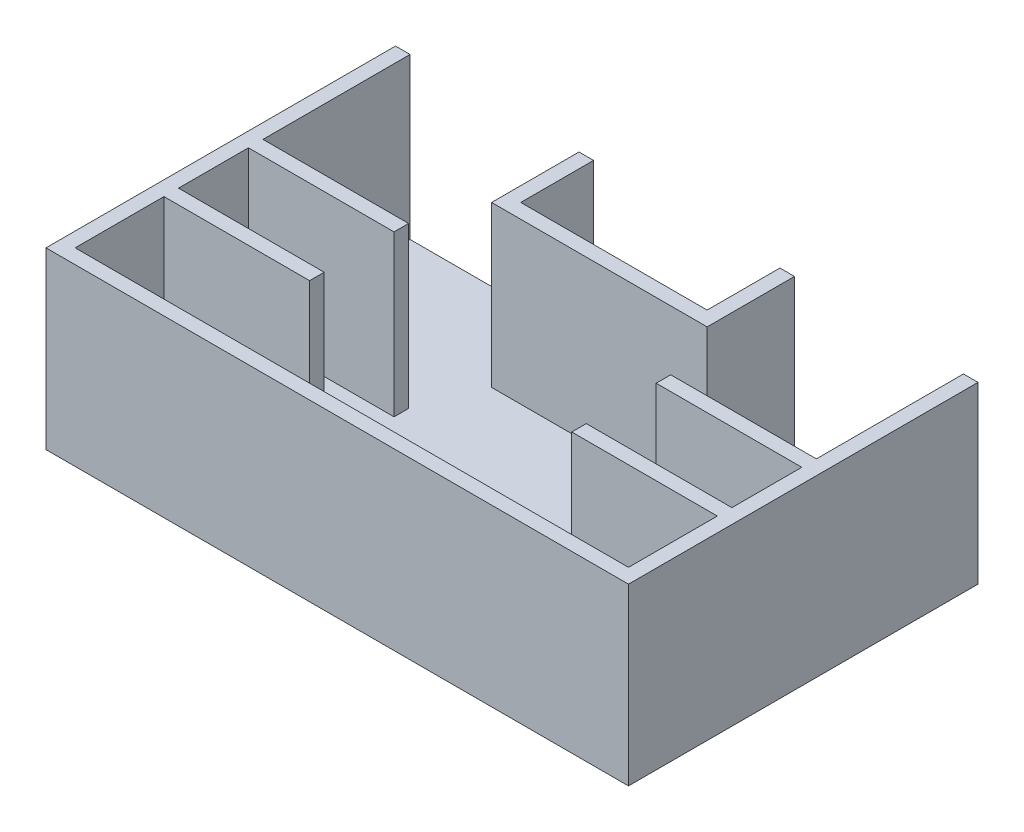
ISO-10303-21;
HEADER;
FILE_DESCRIPTION(('STEP AP214'),'2;1');
FILE_NAME('part.step','',(''),(''),'','','');
FILE_SCHEMA(('AUTOMOTIVE_DESIGN { 1 0 10303 214 1 1 1 1 }'));
ENDSEC;
DATA;
#1=APPLICATION_CONTEXT('core data for automotive mechanical design processes');
#2=APPLICATION_PROTOCOL_DEFINITION('international standard','automotive_design',2000,#1);
#3=PRODUCT_CONTEXT('',#1,'mechanical');
#4=PRODUCT('Part','Part','',(#3));
#5=PRODUCT_RELATED_PRODUCT_CATEGORY('part','',(#4));
#6=PRODUCT_DEFINITION_FORMATION('','',#4);
#7=PRODUCT_DEFINITION_CONTEXT('part definition',#1,'design');
#8=PRODUCT_DEFINITION('design','',#6,#7);
#9=PRODUCT_DEFINITION_SHAPE('','',#8);
#10=(LENGTH_UNIT() NAMED_UNIT(*) SI_UNIT(.MILLI.,.METRE.));
#11=(NAMED_UNIT(*) PLANE_ANGLE_UNIT() SI_UNIT($,.RADIAN.));
#12=(NAMED_UNIT(*) SI_UNIT($,.STERADIAN.) SOLID_ANGLE_UNIT());
#13=UNCERTAINTY_MEASURE_WITH_UNIT(LENGTH_MEASURE(1.E-05),#10,'distance_accuracy_value','');
#14=(GEOMETRIC_REPRESENTATION_CONTEXT(3) GLOBAL_UNCERTAINTY_ASSIGNED_CONTEXT((#13)) GLOBAL_UNIT_ASSIGNED_CONTEXT((#10,
#11,#12)) REPRESENTATION_CONTEXT('',''));
#15=CARTESIAN_POINT('',(0.,0.,0.));
#16=DIRECTION('',(0.,0.,1.));
#17=DIRECTION('',(1.,0.,0.));
#18=AXIS2_PLACEMENT_3D('',#15,#16,#17);
#19=CARTESIAN_POINT('',(0.,30.,0.));
#20=DIRECTION('',(0.,1.,0.));
#21=DIRECTION('',(0.,0.,1.));
#22=AXIS2_PLACEMENT_3D('',#19,#20,#21);
#23=PLANE('',#22);
#24=DIRECTION('',(1.,0.,0.));
#25=VECTOR('',#24,1.);
#26=CARTESIAN_POINT('',(-100.,30.,-10.));
#27=LINE('',#26,#25);
#28=CARTESIAN_POINT('',(-50.,30.,-10.));
#29=VERTEX_POINT('',#28);
#30=CARTESIAN_POINT('',(-47.5,30.,-10.));
#31=VERTEX_POINT('',#30);
#32=EDGE_CURVE('E260',#29,#31,#27,.T.);
#33=ORIENTED_EDGE('',*,*,#32,.F.);
#34=DIRECTION('',(0.,0.,1.));
#35=VECTOR('',#34,1.);
#36=CARTESIAN_POINT('',(-50.,30.,-50.));
#37=LINE('',#36,#35);
#38=CARTESIAN_POINT('',(-50.,30.,50.));
#39=VERTEX_POINT('',#38);
#40=EDGE_CURVE('E278',#29,#39,#37,.T.);
#41=ORIENTED_EDGE('',*,*,#40,.T.);
#42=DIRECTION('',(1.,0.,0.));
#43=VECTOR('',#42,1.);
#44=CARTESIAN_POINT('',(-50.,30.,50.));
#45=LINE('',#44,#43);
#46=CARTESIAN_POINT('',(50.,30.,50.));
#47=VERTEX_POINT('',#46);
#48=EDGE_CURVE('E273',#39,#47,#45,.T.);
#49=ORIENTED_EDGE('',*,*,#48,.T.);
#50=DIRECTION('',(0.,0.,-1.));
#51=VECTOR('',#50,1.);
#52=CARTESIAN_POINT('',(50.,30.,50.));
#53=LINE('',#52,#51);
#54=CARTESIAN_POINT('',(50.,30.,-10.));
#55=VERTEX_POINT('',#54);
#56=EDGE_CURVE('E266',#47,#55,#53,.T.);
#57=ORIENTED_EDGE('',*,*,#56,.T.);
#58=CARTESIAN_POINT('',(47.5,30.,-10.));
#59=VERTEX_POINT('',#58);
#60=EDGE_CURVE('E247',#59,#55,#27,.T.);
#61=ORIENTED_EDGE('',*,*,#60,.F.);
#62=DIRECTION('',(0.,0.,-1.));
#63=VECTOR('',#62,1.);
#64=CARTESIAN_POINT('',(47.5,30.,15.25));
#65=LINE('',#64,#63);
#66=CARTESIAN_POINT('',(47.5,30.,15.25));
#67=VERTEX_POINT('',#66);
#68=EDGE_CURVE('E380',#67,#59,#65,.T.);
#69=ORIENTED_EDGE('',*,*,#68,.F.);
#70=DIRECTION('',(1.,0.,0.));
#71=VECTOR('',#70,1.);
#72=CARTESIAN_POINT('',(47.5,30.,15.25));
#73=LINE('',#72,#71);
#74=CARTESIAN_POINT('',(22.5,30.,15.25));
#75=VERTEX_POINT('',#74);
#76=EDGE_CURVE('E494',#75,#67,#73,.T.);
#77=ORIENTED_EDGE('',*,*,#76,.F.);
#78=DIRECTION('',(0.,0.,-1.));
#79=VECTOR('',#78,1.);
#80=CARTESIAN_POINT('',(22.5,30.,15.25));
#81=LINE('',#80,#79);
#82=CARTESIAN_POINT('',(22.5,30.,17.75));
#83=VERTEX_POINT('',#82);
#84=EDGE_CURVE('E492',#83,#75,#81,.T.);
#85=ORIENTED_EDGE('',*,*,#84,.F.);
#86=DIRECTION('',(-1.,0.,0.));
#87=VECTOR('',#86,1.);
#88=CARTESIAN_POINT('',(47.5,30.,17.75));
#89=LINE('',#88,#87);
#90=CARTESIAN_POINT('',(47.5,30.,17.75));
#91=VERTEX_POINT('',#90);
#92=EDGE_CURVE('E490',#91,#83,#89,.T.);
#93=ORIENTED_EDGE('',*,*,#92,.F.);
#94=DIRECTION('',(0.,0.,-1.));
#95=VECTOR('',#94,1.);
#96=CARTESIAN_POINT('',(47.5,30.,29.75));
#97=LINE('',#96,#95);
#98=CARTESIAN_POINT('',(47.5,30.,29.75));
#99=VERTEX_POINT('',#98);
#100=EDGE_CURVE('E488',#99,#91,#97,.T.);
#101=ORIENTED_EDGE('',*,*,#100,.F.);
#102=DIRECTION('',(1.,0.,0.));
#103=VECTOR('',#102,1.);
#104=CARTESIAN_POINT('',(22.5,30.,29.75));
#105=LINE('',#104,#103);
#106=CARTESIAN_POINT('',(22.5,30.,29.75));
#107=VERTEX_POINT('',#106);
#108=EDGE_CURVE('E486',#107,#99,#105,.T.);
#109=ORIENTED_EDGE('',*,*,#108,.F.);
#110=DIRECTION('',(0.,0.,-1.));
#111=VECTOR('',#110,1.);
#112=CARTESIAN_POINT('',(22.5,30.,29.75));
#113=LINE('',#112,#111);
#114=CARTESIAN_POINT('',(22.5,30.,32.25));
#115=VERTEX_POINT('',#114);
#116=EDGE_CURVE('E484',#115,#107,#113,.T.);
#117=ORIENTED_EDGE('',*,*,#116,.F.);
#118=DIRECTION('',(-1.,0.,0.));
#119=VECTOR('',#118,1.);
#120=CARTESIAN_POINT('',(22.5,30.,32.25));
#121=LINE('',#120,#119);
#122=CARTESIAN_POINT('',(47.5,30.,32.25));
#123=VERTEX_POINT('',#122);
#124=EDGE_CURVE('E482',#123,#115,#121,.T.);
#125=ORIENTED_EDGE('',*,*,#124,.F.);
#126=DIRECTION('',(0.,0.,-1.));
#127=VECTOR('',#126,1.);
#128=CARTESIAN_POINT('',(47.5,30.,47.5));
#129=LINE('',#128,#127);
#130=CARTESIAN_POINT('',(47.5,30.,47.5));
#131=VERTEX_POINT('',#130);
#132=EDGE_CURVE('E480',#131,#123,#129,.T.);
#133=ORIENTED_EDGE('',*,*,#132,.F.);
#134=DIRECTION('',(1.,0.,0.));
#135=VECTOR('',#134,1.);
#136=CARTESIAN_POINT('',(-47.5,30.,47.5));
#137=LINE('',#136,#135);
#138=CARTESIAN_POINT('',(-47.5,30.,47.5));
#139=VERTEX_POINT('',#138);
#140=EDGE_CURVE('E478',#139,#131,#137,.T.);
#141=ORIENTED_EDGE('',*,*,#140,.F.);
#142=DIRECTION('',(0.,0.,1.));
#143=VECTOR('',#142,1.);
#144=CARTESIAN_POINT('',(-47.5,30.,47.5));
#145=LINE('',#144,#143);
#146=CARTESIAN_POINT('',(-47.5,30.,32.25));
#147=VERTEX_POINT('',#146);
#148=EDGE_CURVE('E476',#147,#139,#145,.T.);
#149=ORIENTED_EDGE('',*,*,#148,.F.);
#150=DIRECTION('',(-1.,0.,0.));
#151=VECTOR('',#150,1.);
#152=CARTESIAN_POINT('',(-22.5,30.,32.25));
#153=LINE('',#152,#151);
#154=CARTESIAN_POINT('',(-22.5,30.,32.25));
#155=VERTEX_POINT('',#154);
#156=EDGE_CURVE('E474',#155,#147,#153,.T.);
#157=ORIENTED_EDGE('',*,*,#156,.F.);
#158=DIRECTION('',(0.,0.,1.));
#159=VECTOR('',#158,1.);
#160=CARTESIAN_POINT('',(-22.5,30.,29.75));
#161=LINE('',#160,#159);
#162=CARTESIAN_POINT('',(-22.5,30.,29.75));
#163=VERTEX_POINT('',#162);
#164=EDGE_CURVE('E472',#163,#155,#161,.T.);
#165=ORIENTED_EDGE('',*,*,#164,.F.);
#166=DIRECTION('',(1.,0.,0.));
#167=VECTOR('',#166,1.);
#168=CARTESIAN_POINT('',(-22.5,30.,29.75));
#169=LINE('',#168,#167);
#170=CARTESIAN_POINT('',(-47.5,30.,29.75));
#171=VERTEX_POINT('',#170);
#172=EDGE_CURVE('E470',#171,#163,#169,.T.);
#173=ORIENTED_EDGE('',*,*,#172,.F.);
#174=DIRECTION('',(0.,0.,1.));
#175=VECTOR('',#174,1.);
#176=CARTESIAN_POINT('',(-47.5,30.,29.75));
#177=LINE('',#176,#175);
#178=CARTESIAN_POINT('',(-47.5,30.,17.75));
#179=VERTEX_POINT('',#178);
#180=EDGE_CURVE('E468',#179,#171,#177,.T.);
#181=ORIENTED_EDGE('',*,*,#180,.F.);
#182=DIRECTION('',(-1.,0.,0.));
#183=VECTOR('',#182,1.);
#184=CARTESIAN_POINT('',(-47.5,30.,17.75));
#185=LINE('',#184,#183);
#186=CARTESIAN_POINT('',(-22.5,30.,17.75));
#187=VERTEX_POINT('',#186);
#188=EDGE_CURVE('E466',#187,#179,#185,.T.);
#189=ORIENTED_EDGE('',*,*,#188,.F.);
#190=DIRECTION('',(0.,0.,1.));
#191=VECTOR('',#190,1.);
#192=CARTESIAN_POINT('',(-22.5,30.,15.25));
#193=LINE('',#192,#191);
#194=CARTESIAN_POINT('',(-22.5,30.,15.25));
#195=VERTEX_POINT('',#194);
#196=EDGE_CURVE('E464',#195,#187,#193,.T.);
#197=ORIENTED_EDGE('',*,*,#196,.F.);
#198=DIRECTION('',(1.,0.,0.));
#199=VECTOR('',#198,1.);
#200=CARTESIAN_POINT('',(-47.5,30.,15.25));
#201=LINE('',#200,#199);
#202=CARTESIAN_POINT('',(-47.5,30.,15.25));
#203=VERTEX_POINT('',#202);
#204=EDGE_CURVE('E462',#203,#195,#201,.T.);
#205=ORIENTED_EDGE('',*,*,#204,.F.);
#206=DIRECTION('',(0.,0.,1.));
#207=VECTOR('',#206,1.);
#208=CARTESIAN_POINT('',(-47.5,30.,15.25));
#209=LINE('',#208,#207);
#210=EDGE_CURVE('E460',#31,#203,#209,.T.);
#211=ORIENTED_EDGE('',*,*,#210,.F.);
#212=EDGE_LOOP('',(#33,#41,#49,#57,#61,#69,#77,#85,#93,#101,#109,#117,#125,#133,#141,#149,#157,
#165,#173,#181,#189,#197,#205,#211));
#213=FACE_BOUND('',#212,.T.);
#214=ADVANCED_FACE('F41',(#213),#23,.T.);
#215=CARTESIAN_POINT('',(-50.,2.5,-50.));
#216=DIRECTION('',(1.,0.,0.));
#217=DIRECTION('',(0.,0.,-1.));
#218=AXIS2_PLACEMENT_3D('',#215,#216,#217);
#219=PLANE('',#218);
#220=ORIENTED_EDGE('',*,*,#40,.F.);
#221=DIRECTION('',(0.,1.,0.));
#222=VECTOR('',#221,1.);
#223=CARTESIAN_POINT('',(-50.,30.,-10.));
#224=LINE('',#223,#222);
#225=CARTESIAN_POINT('',(-50.,0.,-10.));
#226=VERTEX_POINT('',#225);
#227=EDGE_CURVE('E434',#226,#29,#224,.T.);
#228=ORIENTED_EDGE('',*,*,#227,.F.);
#229=DIRECTION('',(0.,0.,1.));
#230=VECTOR('',#229,1.);
#231=CARTESIAN_POINT('',(-50.,0.,-50.));
#232=LINE('',#231,#230);
#233=CARTESIAN_POINT('',(-50.,0.,50.));
#234=VERTEX_POINT('',#233);
#235=EDGE_CURVE('E291',#226,#234,#232,.T.);
#236=ORIENTED_EDGE('',*,*,#235,.T.);
#237=DIRECTION('',(0.,-1.,0.));
#238=VECTOR('',#237,1.);
#239=CARTESIAN_POINT('',(-50.,2.5,50.));
#240=LINE('',#239,#238);
#241=EDGE_CURVE('E297',#39,#234,#240,.T.);
#242=ORIENTED_EDGE('',*,*,#241,.F.);
#243=EDGE_LOOP('',(#220,#228,#236,#242));
#244=FACE_BOUND('',#243,.T.);
#245=ADVANCED_FACE('F43',(#244),#219,.F.);
#246=CARTESIAN_POINT('',(50.,2.5,50.));
#247=DIRECTION('',(0.,0.,-1.));
#248=DIRECTION('',(-1.,0.,0.));
#249=AXIS2_PLACEMENT_3D('',#246,#247,#248);
#250=PLANE('',#249);
#251=DIRECTION('',(1.,0.,0.));
#252=VECTOR('',#251,1.);
#253=CARTESIAN_POINT('',(50.,0.,50.));
#254=LINE('',#253,#252);
#255=CARTESIAN_POINT('',(50.,0.,50.));
#256=VERTEX_POINT('',#255);
#257=EDGE_CURVE('E293',#234,#256,#254,.T.);
#258=ORIENTED_EDGE('',*,*,#257,.T.);
#259=DIRECTION('',(0.,-1.,0.));
#260=VECTOR('',#259,1.);
#261=CARTESIAN_POINT('',(50.,2.5,50.));
#262=LINE('',#261,#260);
#263=EDGE_CURVE('E296',#47,#256,#262,.T.);
#264=ORIENTED_EDGE('',*,*,#263,.F.);
#265=ORIENTED_EDGE('',*,*,#48,.F.);
#266=ORIENTED_EDGE('',*,*,#241,.T.);
#267=EDGE_LOOP('',(#258,#264,#265,#266));
#268=FACE_BOUND('',#267,.T.);
#269=ADVANCED_FACE('F422',(#268),#250,.F.);
#270=CARTESIAN_POINT('',(50.,2.5,-50.));
#271=DIRECTION('',(-1.,0.,0.));
#272=DIRECTION('',(0.,0.,1.));
#273=AXIS2_PLACEMENT_3D('',#270,#271,#272);
#274=PLANE('',#273);
#275=DIRECTION('',(0.,0.,-1.));
#276=VECTOR('',#275,1.);
#277=CARTESIAN_POINT('',(50.,0.,-50.));
#278=LINE('',#277,#276);
#279=CARTESIAN_POINT('',(50.,0.,-10.));
#280=VERTEX_POINT('',#279);
#281=EDGE_CURVE('E268',#256,#280,#278,.T.);
#282=ORIENTED_EDGE('',*,*,#281,.T.);
#283=DIRECTION('',(0.,-1.,0.));
#284=VECTOR('',#283,1.);
#285=CARTESIAN_POINT('',(50.,30.,-10.));
#286=LINE('',#285,#284);
#287=EDGE_CURVE('E250',#55,#280,#286,.T.);
#288=ORIENTED_EDGE('',*,*,#287,.F.);
#289=ORIENTED_EDGE('',*,*,#56,.F.);
#290=ORIENTED_EDGE('',*,*,#263,.T.);
#291=EDGE_LOOP('',(#282,#288,#289,#290));
#292=FACE_BOUND('',#291,.T.);
#293=ADVANCED_FACE('F264',(#292),#274,.F.);
#294=CARTESIAN_POINT('',(0.,0.,0.));
#295=DIRECTION('',(0.,-1.,0.));
#296=DIRECTION('',(0.,0.,-1.));
#297=AXIS2_PLACEMENT_3D('',#294,#295,#296);
#298=PLANE('',#297);
#299=DIRECTION('',(1.,0.,0.));
#300=VECTOR('',#299,1.);
#301=CARTESIAN_POINT('',(-100.,0.,-10.));
#302=LINE('',#301,#300);
#303=CARTESIAN_POINT('',(16.,0.,-10.));
#304=VERTEX_POINT('',#303);
#305=EDGE_CURVE('E426',#304,#280,#302,.T.);
#306=ORIENTED_EDGE('',*,*,#305,.T.);
#307=ORIENTED_EDGE('',*,*,#281,.F.);
#308=ORIENTED_EDGE('',*,*,#257,.F.);
#309=ORIENTED_EDGE('',*,*,#235,.F.);
#310=CARTESIAN_POINT('',(-16.,0.,-10.));
#311=VERTEX_POINT('',#310);
#312=EDGE_CURVE('E431',#226,#311,#302,.T.);
#313=ORIENTED_EDGE('',*,*,#312,.T.);
#314=DIRECTION('',(0.,0.,1.));
#315=VECTOR('',#314,1.);
#316=CARTESIAN_POINT('',(-16.,0.,-50.));
#317=LINE('',#316,#315);
#318=CARTESIAN_POINT('',(-16.,0.,2.5));
#319=VERTEX_POINT('',#318);
#320=EDGE_CURVE('E450',#311,#319,#317,.T.);
#321=ORIENTED_EDGE('',*,*,#320,.T.);
#322=DIRECTION('',(1.,0.,0.));
#323=VECTOR('',#322,1.);
#324=CARTESIAN_POINT('',(-16.,0.,2.5));
#325=LINE('',#324,#323);
#326=CARTESIAN_POINT('',(16.,0.,2.5));
#327=VERTEX_POINT('',#326);
#328=EDGE_CURVE('E448',#319,#327,#325,.T.);
#329=ORIENTED_EDGE('',*,*,#328,.T.);
#330=DIRECTION('',(0.,0.,-1.));
#331=VECTOR('',#330,1.);
#332=CARTESIAN_POINT('',(16.,0.,2.5));
#333=LINE('',#332,#331);
#334=EDGE_CURVE('E429',#327,#304,#333,.T.);
#335=ORIENTED_EDGE('',*,*,#334,.T.);
#336=EDGE_LOOP('',(#306,#307,#308,#309,#313,#321,#329,#335));
#337=FACE_BOUND('',#336,.T.);
#338=ADVANCED_FACE('F424',(#337),#298,.T.);
#339=CARTESIAN_POINT('',(-18.5,30.,-10.));
#340=VERTEX_POINT('',#339);
#341=CARTESIAN_POINT('',(-16.,30.,-10.));
#342=VERTEX_POINT('',#341);
#343=EDGE_CURVE('E435',#340,#342,#27,.T.);
#344=ORIENTED_EDGE('',*,*,#343,.F.);
#345=DIRECTION('',(0.,0.,-1.));
#346=VECTOR('',#345,1.);
#347=CARTESIAN_POINT('',(-18.5,30.,5.00000000000001));
#348=LINE('',#347,#346);
#349=CARTESIAN_POINT('',(-18.5,30.,5.00000000000001));
#350=VERTEX_POINT('',#349);
#351=EDGE_CURVE('E457',#350,#340,#348,.T.);
#352=ORIENTED_EDGE('',*,*,#351,.F.);
#353=DIRECTION('',(-1.,0.,0.));
#354=VECTOR('',#353,1.);
#355=CARTESIAN_POINT('',(18.5,30.,5.));
#356=LINE('',#355,#354);
#357=CARTESIAN_POINT('',(18.5,30.,5.));
#358=VERTEX_POINT('',#357);
#359=EDGE_CURVE('E455',#358,#350,#356,.T.);
#360=ORIENTED_EDGE('',*,*,#359,.F.);
#361=DIRECTION('',(0.,0.,1.));
#362=VECTOR('',#361,1.);
#363=CARTESIAN_POINT('',(18.5,30.,-47.5));
#364=LINE('',#363,#362);
#365=CARTESIAN_POINT('',(18.5,30.,-10.));
#366=VERTEX_POINT('',#365);
#367=EDGE_CURVE('E376',#366,#358,#364,.T.);
#368=ORIENTED_EDGE('',*,*,#367,.F.);
#369=CARTESIAN_POINT('',(16.,30.,-10.));
#370=VERTEX_POINT('',#369);
#371=EDGE_CURVE('E258',#370,#366,#27,.T.);
#372=ORIENTED_EDGE('',*,*,#371,.F.);
#373=DIRECTION('',(0.,0.,1.));
#374=VECTOR('',#373,1.);
#375=CARTESIAN_POINT('',(16.,30.,-47.5));
#376=LINE('',#375,#374);
#377=CARTESIAN_POINT('',(16.,30.,2.5));
#378=VERTEX_POINT('',#377);
#379=EDGE_CURVE('E274',#370,#378,#376,.T.);
#380=ORIENTED_EDGE('',*,*,#379,.T.);
#381=DIRECTION('',(-1.,0.,0.));
#382=VECTOR('',#381,1.);
#383=CARTESIAN_POINT('',(-16.,30.,2.5));
#384=LINE('',#383,#382);
#385=CARTESIAN_POINT('',(-16.,30.,2.5));
#386=VERTEX_POINT('',#385);
#387=EDGE_CURVE('E276',#378,#386,#384,.T.);
#388=ORIENTED_EDGE('',*,*,#387,.T.);
#389=DIRECTION('',(0.,0.,-1.));
#390=VECTOR('',#389,1.);
#391=CARTESIAN_POINT('',(-16.,30.,-47.5));
#392=LINE('',#391,#390);
#393=EDGE_CURVE('E283',#386,#342,#392,.T.);
#394=ORIENTED_EDGE('',*,*,#393,.T.);
#395=EDGE_LOOP('',(#344,#352,#360,#368,#372,#380,#388,#394));
#396=FACE_BOUND('',#395,.T.);
#397=ADVANCED_FACE('F511',(#396),#23,.T.);
#398=CARTESIAN_POINT('',(16.,30.,2.5));
#399=DIRECTION('',(1.,0.,0.));
#400=DIRECTION('',(0.,0.,-1.));
#401=AXIS2_PLACEMENT_3D('',#398,#399,#400);
#402=PLANE('',#401);
#403=ORIENTED_EDGE('',*,*,#379,.F.);
#404=DIRECTION('',(0.,-1.,0.));
#405=VECTOR('',#404,1.);
#406=CARTESIAN_POINT('',(16.,30.,-10.));
#407=LINE('',#406,#405);
#408=EDGE_CURVE('E446',#370,#304,#407,.T.);
#409=ORIENTED_EDGE('',*,*,#408,.T.);
#410=ORIENTED_EDGE('',*,*,#334,.F.);
#411=DIRECTION('',(0.,-1.,0.));
#412=VECTOR('',#411,1.);
#413=CARTESIAN_POINT('',(16.,30.,2.5));
#414=LINE('',#413,#412);
#415=EDGE_CURVE('E289',#378,#327,#414,.T.);
#416=ORIENTED_EDGE('',*,*,#415,.F.);
#417=EDGE_LOOP('',(#403,#409,#410,#416));
#418=FACE_BOUND('',#417,.T.);
#419=ADVANCED_FACE('F537',(#418),#402,.F.);
#420=CARTESIAN_POINT('',(-16.,30.,2.5));
#421=DIRECTION('',(0.,0.,1.));
#422=DIRECTION('',(1.,0.,0.));
#423=AXIS2_PLACEMENT_3D('',#420,#421,#422);
#424=PLANE('',#423);
#425=ORIENTED_EDGE('',*,*,#415,.T.);
#426=ORIENTED_EDGE('',*,*,#328,.F.);
#427=DIRECTION('',(0.,-1.,0.));
#428=VECTOR('',#427,1.);
#429=CARTESIAN_POINT('',(-16.,30.,2.5));
#430=LINE('',#429,#428);
#431=EDGE_CURVE('E286',#386,#319,#430,.T.);
#432=ORIENTED_EDGE('',*,*,#431,.F.);
#433=ORIENTED_EDGE('',*,*,#387,.F.);
#434=EDGE_LOOP('',(#425,#426,#432,#433));
#435=FACE_BOUND('',#434,.T.);
#436=ADVANCED_FACE('F527',(#435),#424,.F.);
#437=CARTESIAN_POINT('',(-16.,30.,-47.5));
#438=DIRECTION('',(-1.,0.,0.));
#439=DIRECTION('',(0.,0.,1.));
#440=AXIS2_PLACEMENT_3D('',#437,#438,#439);
#441=PLANE('',#440);
#442=ORIENTED_EDGE('',*,*,#320,.F.);
#443=DIRECTION('',(0.,1.,0.));
#444=VECTOR('',#443,1.);
#445=CARTESIAN_POINT('',(-16.,30.,-10.));
#446=LINE('',#445,#444);
#447=EDGE_CURVE('E443',#311,#342,#446,.T.);
#448=ORIENTED_EDGE('',*,*,#447,.T.);
#449=ORIENTED_EDGE('',*,*,#393,.F.);
#450=ORIENTED_EDGE('',*,*,#431,.T.);
#451=EDGE_LOOP('',(#442,#448,#449,#450));
#452=FACE_BOUND('',#451,.T.);
#453=ADVANCED_FACE('F519',(#452),#441,.F.);
#454=CARTESIAN_POINT('',(18.5,30.,-47.5));
#455=DIRECTION('',(1.,0.,0.));
#456=DIRECTION('',(0.,0.,-1.));
#457=AXIS2_PLACEMENT_3D('',#454,#455,#456);
#458=PLANE('',#457);
#459=DIRECTION('',(0.,-1.,0.));
#460=VECTOR('',#459,1.);
#461=CARTESIAN_POINT('',(18.5,30.,-10.));
#462=LINE('',#461,#460);
#463=CARTESIAN_POINT('',(18.5,2.5,-10.));
#464=VERTEX_POINT('',#463);
#465=EDGE_CURVE('E64',#366,#464,#462,.T.);
#466=ORIENTED_EDGE('',*,*,#465,.F.);
#467=ORIENTED_EDGE('',*,*,#367,.T.);
#468=DIRECTION('',(0.,-1.,0.));
#469=VECTOR('',#468,1.);
#470=CARTESIAN_POINT('',(18.5,30.,5.));
#471=LINE('',#470,#469);
#472=CARTESIAN_POINT('',(18.5,2.5,5.));
#473=VERTEX_POINT('',#472);
#474=EDGE_CURVE('E415',#358,#473,#471,.T.);
#475=ORIENTED_EDGE('',*,*,#474,.T.);
#476=DIRECTION('',(0.,0.,1.));
#477=VECTOR('',#476,1.);
#478=CARTESIAN_POINT('',(18.5,2.5,-47.5));
#479=LINE('',#478,#477);
#480=EDGE_CURVE('E452',#464,#473,#479,.T.);
#481=ORIENTED_EDGE('',*,*,#480,.F.);
#482=EDGE_LOOP('',(#466,#467,#475,#481));
#483=FACE_BOUND('',#482,.T.);
#484=ADVANCED_FACE('F517',(#483),#458,.T.);
#485=CARTESIAN_POINT('',(18.5,30.,5.));
#486=DIRECTION('',(0.,0.,1.));
#487=DIRECTION('',(1.,0.,0.));
#488=AXIS2_PLACEMENT_3D('',#485,#486,#487);
#489=PLANE('',#488);
#490=DIRECTION('',(-1.,0.,0.));
#491=VECTOR('',#490,1.);
#492=CARTESIAN_POINT('',(18.5,2.5,5.));
#493=LINE('',#492,#491);
#494=CARTESIAN_POINT('',(-18.5,2.5,5.00000000000001));
#495=VERTEX_POINT('',#494);
#496=EDGE_CURVE('E323',#473,#495,#493,.T.);
#497=ORIENTED_EDGE('',*,*,#496,.F.);
#498=ORIENTED_EDGE('',*,*,#474,.F.);
#499=ORIENTED_EDGE('',*,*,#359,.T.);
#500=DIRECTION('',(0.,-1.,0.));
#501=VECTOR('',#500,1.);
#502=CARTESIAN_POINT('',(-18.5,30.,5.00000000000001));
#503=LINE('',#502,#501);
#504=EDGE_CURVE('E413',#350,#495,#503,.T.);
#505=ORIENTED_EDGE('',*,*,#504,.T.);
#506=EDGE_LOOP('',(#497,#498,#499,#505));
#507=FACE_BOUND('',#506,.T.);
#508=ADVANCED_FACE('F502',(#507),#489,.T.);
#509=CARTESIAN_POINT('',(-18.5,30.,5.00000000000001));
#510=DIRECTION('',(-1.,0.,0.));
#511=DIRECTION('',(0.,0.,1.));
#512=AXIS2_PLACEMENT_3D('',#509,#510,#511);
#513=PLANE('',#512);
#514=DIRECTION('',(0.,1.,0.));
#515=VECTOR('',#514,1.);
#516=CARTESIAN_POINT('',(-18.5,30.,-10.));
#517=LINE('',#516,#515);
#518=CARTESIAN_POINT('',(-18.5,2.5,-10.));
#519=VERTEX_POINT('',#518);
#520=EDGE_CURVE('E439',#519,#340,#517,.T.);
#521=ORIENTED_EDGE('',*,*,#520,.F.);
#522=DIRECTION('',(0.,0.,-1.));
#523=VECTOR('',#522,1.);
#524=CARTESIAN_POINT('',(-18.5,2.5,5.00000000000001));
#525=LINE('',#524,#523);
#526=EDGE_CURVE('E311',#495,#519,#525,.T.);
#527=ORIENTED_EDGE('',*,*,#526,.F.);
#528=ORIENTED_EDGE('',*,*,#504,.F.);
#529=ORIENTED_EDGE('',*,*,#351,.T.);
#530=EDGE_LOOP('',(#521,#527,#528,#529));
#531=FACE_BOUND('',#530,.T.);
#532=ADVANCED_FACE('F507',(#531),#513,.T.);
#533=CARTESIAN_POINT('',(-47.5,30.,15.25));
#534=DIRECTION('',(1.,0.,0.));
#535=DIRECTION('',(0.,0.,-1.));
#536=AXIS2_PLACEMENT_3D('',#533,#534,#535);
#537=PLANE('',#536);
#538=DIRECTION('',(0.,-1.,0.));
#539=VECTOR('',#538,1.);
#540=CARTESIAN_POINT('',(-47.5,30.,-10.));
#541=LINE('',#540,#539);
#542=CARTESIAN_POINT('',(-47.5,2.5,-10.));
#543=VERTEX_POINT('',#542);
#544=EDGE_CURVE('E56',#31,#543,#541,.T.);
#545=ORIENTED_EDGE('',*,*,#544,.F.);
#546=ORIENTED_EDGE('',*,*,#210,.T.);
#547=DIRECTION('',(0.,-1.,0.));
#548=VECTOR('',#547,1.);
#549=CARTESIAN_POINT('',(-47.5,30.,15.25));
#550=LINE('',#549,#548);
#551=CARTESIAN_POINT('',(-47.5,2.5,15.25));
#552=VERTEX_POINT('',#551);
#553=EDGE_CURVE('E317',#203,#552,#550,.T.);
#554=ORIENTED_EDGE('',*,*,#553,.T.);
#555=DIRECTION('',(0.,0.,1.));
#556=VECTOR('',#555,1.);
#557=CARTESIAN_POINT('',(-47.5,2.5,15.25));
#558=LINE('',#557,#556);
#559=EDGE_CURVE('E307',#543,#552,#558,.T.);
#560=ORIENTED_EDGE('',*,*,#559,.F.);
#561=EDGE_LOOP('',(#545,#546,#554,#560));
#562=FACE_BOUND('',#561,.T.);
#563=ADVANCED_FACE('F314',(#562),#537,.T.);
#564=CARTESIAN_POINT('',(-47.5,30.,15.25));
#565=DIRECTION('',(0.,0.,-1.));
#566=DIRECTION('',(-1.,0.,0.));
#567=AXIS2_PLACEMENT_3D('',#564,#565,#566);
#568=PLANE('',#567);
#569=DIRECTION('',(1.,0.,0.));
#570=VECTOR('',#569,1.);
#571=CARTESIAN_POINT('',(-47.5,2.5,15.25));
#572=LINE('',#571,#570);
#573=CARTESIAN_POINT('',(-22.5,2.5,15.25));
#574=VERTEX_POINT('',#573);
#575=EDGE_CURVE('E319',#552,#574,#572,.T.);
#576=ORIENTED_EDGE('',*,*,#575,.F.);
#577=ORIENTED_EDGE('',*,*,#553,.F.);
#578=ORIENTED_EDGE('',*,*,#204,.T.);
#579=DIRECTION('',(0.,-1.,0.));
#580=VECTOR('',#579,1.);
#581=CARTESIAN_POINT('',(-22.5,30.,15.25));
#582=LINE('',#581,#580);
#583=EDGE_CURVE('E410',#195,#574,#582,.T.);
#584=ORIENTED_EDGE('',*,*,#583,.T.);
#585=EDGE_LOOP('',(#576,#577,#578,#584));
#586=FACE_BOUND('',#585,.T.);
#587=ADVANCED_FACE('F565',(#586),#568,.T.);
#588=CARTESIAN_POINT('',(-22.5,30.,15.25));
#589=DIRECTION('',(1.,0.,0.));
#590=DIRECTION('',(0.,0.,-1.));
#591=AXIS2_PLACEMENT_3D('',#588,#589,#590);
#592=PLANE('',#591);
#593=DIRECTION('',(0.,0.,1.));
#594=VECTOR('',#593,1.);
#595=CARTESIAN_POINT('',(-22.5,2.5,15.25));
#596=LINE('',#595,#594);
#597=CARTESIAN_POINT('',(-22.5,2.5,17.75));
#598=VERTEX_POINT('',#597);
#599=EDGE_CURVE('E321',#574,#598,#596,.T.);
#600=ORIENTED_EDGE('',*,*,#599,.F.);
#601=ORIENTED_EDGE('',*,*,#583,.F.);
#602=ORIENTED_EDGE('',*,*,#196,.T.);
#603=DIRECTION('',(0.,-1.,0.));
#604=VECTOR('',#603,1.);
#605=CARTESIAN_POINT('',(-22.5,30.,17.75));
#606=LINE('',#605,#604);
#607=EDGE_CURVE('E408',#187,#598,#606,.T.);
#608=ORIENTED_EDGE('',*,*,#607,.T.);
#609=EDGE_LOOP('',(#600,#601,#602,#608));
#610=FACE_BOUND('',#609,.T.);
#611=ADVANCED_FACE('F569',(#610),#592,.T.);
#612=CARTESIAN_POINT('',(-47.5,30.,17.75));
#613=DIRECTION('',(0.,0.,1.));
#614=DIRECTION('',(1.,0.,0.));
#615=AXIS2_PLACEMENT_3D('',#612,#613,#614);
#616=PLANE('',#615);
#617=DIRECTION('',(-1.,0.,0.));
#618=VECTOR('',#617,1.);
#619=CARTESIAN_POINT('',(-47.5,2.5,17.75));
#620=LINE('',#619,#618);
#621=CARTESIAN_POINT('',(-47.5,2.5,17.75));
#622=VERTEX_POINT('',#621);
#623=EDGE_CURVE('E329',#598,#622,#620,.T.);
#624=ORIENTED_EDGE('',*,*,#623,.F.);
#625=ORIENTED_EDGE('',*,*,#607,.F.);
#626=ORIENTED_EDGE('',*,*,#188,.T.);
#627=DIRECTION('',(0.,-1.,0.));
#628=VECTOR('',#627,1.);
#629=CARTESIAN_POINT('',(-47.5,30.,17.75));
#630=LINE('',#629,#628);
#631=EDGE_CURVE('E406',#179,#622,#630,.T.);
#632=ORIENTED_EDGE('',*,*,#631,.T.);
#633=EDGE_LOOP('',(#624,#625,#626,#632));
#634=FACE_BOUND('',#633,.T.);
#635=ADVANCED_FACE('F579',(#634),#616,.T.);
#636=CARTESIAN_POINT('',(-47.5,30.,29.75));
#637=DIRECTION('',(1.,0.,0.));
#638=DIRECTION('',(0.,0.,-1.));
#639=AXIS2_PLACEMENT_3D('',#636,#637,#638);
#640=PLANE('',#639);
#641=DIRECTION('',(0.,0.,1.));
#642=VECTOR('',#641,1.);
#643=CARTESIAN_POINT('',(-47.5,2.5,29.75));
#644=LINE('',#643,#642);
#645=CARTESIAN_POINT('',(-47.5,2.5,29.75));
#646=VERTEX_POINT('',#645);
#647=EDGE_CURVE('E332',#622,#646,#644,.T.);
#648=ORIENTED_EDGE('',*,*,#647,.F.);
#649=ORIENTED_EDGE('',*,*,#631,.F.);
#650=ORIENTED_EDGE('',*,*,#180,.T.);
#651=DIRECTION('',(0.,-1.,0.));
#652=VECTOR('',#651,1.);
#653=CARTESIAN_POINT('',(-47.5,30.,29.75));
#654=LINE('',#653,#652);
#655=EDGE_CURVE('E404',#171,#646,#654,.T.);
#656=ORIENTED_EDGE('',*,*,#655,.T.);
#657=EDGE_LOOP('',(#648,#649,#650,#656));
#658=FACE_BOUND('',#657,.T.);
#659=ADVANCED_FACE('F588',(#658),#640,.T.);
#660=CARTESIAN_POINT('',(-22.5,30.,29.75));
#661=DIRECTION('',(0.,0.,-1.));
#662=DIRECTION('',(-1.,0.,0.));
#663=AXIS2_PLACEMENT_3D('',#660,#661,#662);
#664=PLANE('',#663);
#665=DIRECTION('',(1.,0.,0.));
#666=VECTOR('',#665,1.);
#667=CARTESIAN_POINT('',(-22.5,2.5,29.75));
#668=LINE('',#667,#666);
#669=CARTESIAN_POINT('',(-22.5,2.5,29.75));
#670=VERTEX_POINT('',#669);
#671=EDGE_CURVE('E335',#646,#670,#668,.T.);
#672=ORIENTED_EDGE('',*,*,#671,.F.);
#673=ORIENTED_EDGE('',*,*,#655,.F.);
#674=ORIENTED_EDGE('',*,*,#172,.T.);
#675=DIRECTION('',(0.,-1.,0.));
#676=VECTOR('',#675,1.);
#677=CARTESIAN_POINT('',(-22.5,30.,29.75));
#678=LINE('',#677,#676);
#679=EDGE_CURVE('E402',#163,#670,#678,.T.);
#680=ORIENTED_EDGE('',*,*,#679,.T.);
#681=EDGE_LOOP('',(#672,#673,#674,#680));
#682=FACE_BOUND('',#681,.T.);
#683=ADVANCED_FACE('F597',(#682),#664,.T.);
#684=CARTESIAN_POINT('',(-22.5,30.,29.75));
#685=DIRECTION('',(1.,0.,0.));
#686=DIRECTION('',(0.,0.,-1.));
#687=AXIS2_PLACEMENT_3D('',#684,#685,#686);
#688=PLANE('',#687);
#689=DIRECTION('',(0.,0.,1.));
#690=VECTOR('',#689,1.);
#691=CARTESIAN_POINT('',(-22.5,2.5,29.75));
#692=LINE('',#691,#690);
#693=CARTESIAN_POINT('',(-22.5,2.5,32.25));
#694=VERTEX_POINT('',#693);
#695=EDGE_CURVE('E338',#670,#694,#692,.T.);
#696=ORIENTED_EDGE('',*,*,#695,.F.);
#697=ORIENTED_EDGE('',*,*,#679,.F.);
#698=ORIENTED_EDGE('',*,*,#164,.T.);
#699=DIRECTION('',(0.,-1.,0.));
#700=VECTOR('',#699,1.);
#701=CARTESIAN_POINT('',(-22.5,30.,32.25));
#702=LINE('',#701,#700);
#703=EDGE_CURVE('E400',#155,#694,#702,.T.);
#704=ORIENTED_EDGE('',*,*,#703,.T.);
#705=EDGE_LOOP('',(#696,#697,#698,#704));
#706=FACE_BOUND('',#705,.T.);
#707=ADVANCED_FACE('F606',(#706),#688,.T.);
#708=CARTESIAN_POINT('',(-22.5,30.,32.25));
#709=DIRECTION('',(0.,0.,1.));
#710=DIRECTION('',(1.,0.,0.));
#711=AXIS2_PLACEMENT_3D('',#708,#709,#710);
#712=PLANE('',#711);
#713=DIRECTION('',(-1.,0.,0.));
#714=VECTOR('',#713,1.);
#715=CARTESIAN_POINT('',(-22.5,2.5,32.25));
#716=LINE('',#715,#714);
#717=CARTESIAN_POINT('',(-47.5,2.5,32.25));
#718=VERTEX_POINT('',#717);
#719=EDGE_CURVE('E341',#694,#718,#716,.T.);
#720=ORIENTED_EDGE('',*,*,#719,.F.);
#721=ORIENTED_EDGE('',*,*,#703,.F.);
#722=ORIENTED_EDGE('',*,*,#156,.T.);
#723=DIRECTION('',(0.,-1.,0.));
#724=VECTOR('',#723,1.);
#725=CARTESIAN_POINT('',(-47.5,30.,32.25));
#726=LINE('',#725,#724);
#727=EDGE_CURVE('E398',#147,#718,#726,.T.);
#728=ORIENTED_EDGE('',*,*,#727,.T.);
#729=EDGE_LOOP('',(#720,#721,#722,#728));
#730=FACE_BOUND('',#729,.T.);
#731=ADVANCED_FACE('F615',(#730),#712,.T.);
#732=CARTESIAN_POINT('',(-47.5,30.,47.5));
#733=DIRECTION('',(1.,0.,0.));
#734=DIRECTION('',(0.,0.,-1.));
#735=AXIS2_PLACEMENT_3D('',#732,#733,#734);
#736=PLANE('',#735);
#737=DIRECTION('',(0.,0.,1.));
#738=VECTOR('',#737,1.);
#739=CARTESIAN_POINT('',(-47.5,2.5,47.5));
#740=LINE('',#739,#738);
#741=CARTESIAN_POINT('',(-47.5,2.5,47.5));
#742=VERTEX_POINT('',#741);
#743=EDGE_CURVE('E344',#718,#742,#740,.T.);
#744=ORIENTED_EDGE('',*,*,#743,.F.);
#745=ORIENTED_EDGE('',*,*,#727,.F.);
#746=ORIENTED_EDGE('',*,*,#148,.T.);
#747=DIRECTION('',(0.,-1.,0.));
#748=VECTOR('',#747,1.);
#749=CARTESIAN_POINT('',(-47.5,30.,47.5));
#750=LINE('',#749,#748);
#751=EDGE_CURVE('E396',#139,#742,#750,.T.);
#752=ORIENTED_EDGE('',*,*,#751,.T.);
#753=EDGE_LOOP('',(#744,#745,#746,#752));
#754=FACE_BOUND('',#753,.T.);
#755=ADVANCED_FACE('F624',(#754),#736,.T.);
#756=CARTESIAN_POINT('',(-47.5,30.,47.5));
#757=DIRECTION('',(0.,0.,-1.));
#758=DIRECTION('',(-1.,0.,0.));
#759=AXIS2_PLACEMENT_3D('',#756,#757,#758);
#760=PLANE('',#759);
#761=DIRECTION('',(1.,0.,0.));
#762=VECTOR('',#761,1.);
#763=CARTESIAN_POINT('',(-47.5,2.5,47.5));
#764=LINE('',#763,#762);
#765=CARTESIAN_POINT('',(47.5,2.5,47.5));
#766=VERTEX_POINT('',#765);
#767=EDGE_CURVE('E347',#742,#766,#764,.T.);
#768=ORIENTED_EDGE('',*,*,#767,.F.);
#769=ORIENTED_EDGE('',*,*,#751,.F.);
#770=ORIENTED_EDGE('',*,*,#140,.T.);
#771=DIRECTION('',(0.,-1.,0.));
#772=VECTOR('',#771,1.);
#773=CARTESIAN_POINT('',(47.5,30.,47.5));
#774=LINE('',#773,#772);
#775=EDGE_CURVE('E394',#131,#766,#774,.T.);
#776=ORIENTED_EDGE('',*,*,#775,.T.);
#777=EDGE_LOOP('',(#768,#769,#770,#776));
#778=FACE_BOUND('',#777,.T.);
#779=ADVANCED_FACE('F633',(#778),#760,.T.);
#780=CARTESIAN_POINT('',(47.5,30.,47.5));
#781=DIRECTION('',(-1.,0.,0.));
#782=DIRECTION('',(0.,0.,1.));
#783=AXIS2_PLACEMENT_3D('',#780,#781,#782);
#784=PLANE('',#783);
#785=DIRECTION('',(0.,0.,-1.));
#786=VECTOR('',#785,1.);
#787=CARTESIAN_POINT('',(47.5,2.5,47.5));
#788=LINE('',#787,#786);
#789=CARTESIAN_POINT('',(47.5,2.5,32.25));
#790=VERTEX_POINT('',#789);
#791=EDGE_CURVE('E350',#766,#790,#788,.T.);
#792=ORIENTED_EDGE('',*,*,#791,.F.);
#793=ORIENTED_EDGE('',*,*,#775,.F.);
#794=ORIENTED_EDGE('',*,*,#132,.T.);
#795=DIRECTION('',(0.,-1.,0.));
#796=VECTOR('',#795,1.);
#797=CARTESIAN_POINT('',(47.5,30.,32.25));
#798=LINE('',#797,#796);
#799=EDGE_CURVE('E392',#123,#790,#798,.T.);
#800=ORIENTED_EDGE('',*,*,#799,.T.);
#801=EDGE_LOOP('',(#792,#793,#794,#800));
#802=FACE_BOUND('',#801,.T.);
#803=ADVANCED_FACE('F642',(#802),#784,.T.);
#804=CARTESIAN_POINT('',(22.5,30.,32.25));
#805=DIRECTION('',(0.,0.,1.));
#806=DIRECTION('',(1.,0.,0.));
#807=AXIS2_PLACEMENT_3D('',#804,#805,#806);
#808=PLANE('',#807);
#809=DIRECTION('',(-1.,0.,0.));
#810=VECTOR('',#809,1.);
#811=CARTESIAN_POINT('',(22.5,2.5,32.25));
#812=LINE('',#811,#810);
#813=CARTESIAN_POINT('',(22.5,2.5,32.25));
#814=VERTEX_POINT('',#813);
#815=EDGE_CURVE('E353',#790,#814,#812,.T.);
#816=ORIENTED_EDGE('',*,*,#815,.F.);
#817=ORIENTED_EDGE('',*,*,#799,.F.);
#818=ORIENTED_EDGE('',*,*,#124,.T.);
#819=DIRECTION('',(0.,-1.,0.));
#820=VECTOR('',#819,1.);
#821=CARTESIAN_POINT('',(22.5,30.,32.25));
#822=LINE('',#821,#820);
#823=EDGE_CURVE('E390',#115,#814,#822,.T.);
#824=ORIENTED_EDGE('',*,*,#823,.T.);
#825=EDGE_LOOP('',(#816,#817,#818,#824));
#826=FACE_BOUND('',#825,.T.);
#827=ADVANCED_FACE('F651',(#826),#808,.T.);
#828=CARTESIAN_POINT('',(22.5,30.,29.75));
#829=DIRECTION('',(-1.,0.,0.));
#830=DIRECTION('',(0.,0.,1.));
#831=AXIS2_PLACEMENT_3D('',#828,#829,#830);
#832=PLANE('',#831);
#833=DIRECTION('',(0.,0.,-1.));
#834=VECTOR('',#833,1.);
#835=CARTESIAN_POINT('',(22.5,2.5,29.75));
#836=LINE('',#835,#834);
#837=CARTESIAN_POINT('',(22.5,2.5,29.75));
#838=VERTEX_POINT('',#837);
#839=EDGE_CURVE('E356',#814,#838,#836,.T.);
#840=ORIENTED_EDGE('',*,*,#839,.F.);
#841=ORIENTED_EDGE('',*,*,#823,.F.);
#842=ORIENTED_EDGE('',*,*,#116,.T.);
#843=DIRECTION('',(0.,-1.,0.));
#844=VECTOR('',#843,1.);
#845=CARTESIAN_POINT('',(22.5,30.,29.75));
#846=LINE('',#845,#844);
#847=EDGE_CURVE('E388',#107,#838,#846,.T.);
#848=ORIENTED_EDGE('',*,*,#847,.T.);
#849=EDGE_LOOP('',(#840,#841,#842,#848));
#850=FACE_BOUND('',#849,.T.);
#851=ADVANCED_FACE('F660',(#850),#832,.T.);
#852=CARTESIAN_POINT('',(22.5,30.,29.75));
#853=DIRECTION('',(0.,0.,-1.));
#854=DIRECTION('',(-1.,0.,0.));
#855=AXIS2_PLACEMENT_3D('',#852,#853,#854);
#856=PLANE('',#855);
#857=DIRECTION('',(1.,0.,0.));
#858=VECTOR('',#857,1.);
#859=CARTESIAN_POINT('',(22.5,2.5,29.75));
#860=LINE('',#859,#858);
#861=CARTESIAN_POINT('',(47.5,2.5,29.75));
#862=VERTEX_POINT('',#861);
#863=EDGE_CURVE('E359',#838,#862,#860,.T.);
#864=ORIENTED_EDGE('',*,*,#863,.F.);
#865=ORIENTED_EDGE('',*,*,#847,.F.);
#866=ORIENTED_EDGE('',*,*,#108,.T.);
#867=DIRECTION('',(0.,-1.,0.));
#868=VECTOR('',#867,1.);
#869=CARTESIAN_POINT('',(47.5,30.,29.75));
#870=LINE('',#869,#868);
#871=EDGE_CURVE('E386',#99,#862,#870,.T.);
#872=ORIENTED_EDGE('',*,*,#871,.T.);
#873=EDGE_LOOP('',(#864,#865,#866,#872));
#874=FACE_BOUND('',#873,.T.);
#875=ADVANCED_FACE('F669',(#874),#856,.T.);
#876=CARTESIAN_POINT('',(47.5,30.,29.75));
#877=DIRECTION('',(-1.,0.,0.));
#878=DIRECTION('',(0.,0.,1.));
#879=AXIS2_PLACEMENT_3D('',#876,#877,#878);
#880=PLANE('',#879);
#881=DIRECTION('',(0.,0.,-1.));
#882=VECTOR('',#881,1.);
#883=CARTESIAN_POINT('',(47.5,2.5,29.75));
#884=LINE('',#883,#882);
#885=CARTESIAN_POINT('',(47.5,2.5,17.75));
#886=VERTEX_POINT('',#885);
#887=EDGE_CURVE('E362',#862,#886,#884,.T.);
#888=ORIENTED_EDGE('',*,*,#887,.F.);
#889=ORIENTED_EDGE('',*,*,#871,.F.);
#890=ORIENTED_EDGE('',*,*,#100,.T.);
#891=DIRECTION('',(0.,-1.,0.));
#892=VECTOR('',#891,1.);
#893=CARTESIAN_POINT('',(47.5,30.,17.75));
#894=LINE('',#893,#892);
#895=EDGE_CURVE('E384',#91,#886,#894,.T.);
#896=ORIENTED_EDGE('',*,*,#895,.T.);
#897=EDGE_LOOP('',(#888,#889,#890,#896));
#898=FACE_BOUND('',#897,.T.);
#899=ADVANCED_FACE('F678',(#898),#880,.T.);
#900=CARTESIAN_POINT('',(47.5,30.,17.75));
#901=DIRECTION('',(0.,0.,1.));
#902=DIRECTION('',(1.,0.,0.));
#903=AXIS2_PLACEMENT_3D('',#900,#901,#902);
#904=PLANE('',#903);
#905=DIRECTION('',(-1.,0.,0.));
#906=VECTOR('',#905,1.);
#907=CARTESIAN_POINT('',(47.5,2.5,17.75));
#908=LINE('',#907,#906);
#909=CARTESIAN_POINT('',(22.5,2.5,17.75));
#910=VERTEX_POINT('',#909);
#911=EDGE_CURVE('E365',#886,#910,#908,.T.);
#912=ORIENTED_EDGE('',*,*,#911,.F.);
#913=ORIENTED_EDGE('',*,*,#895,.F.);
#914=ORIENTED_EDGE('',*,*,#92,.T.);
#915=DIRECTION('',(0.,-1.,0.));
#916=VECTOR('',#915,1.);
#917=CARTESIAN_POINT('',(22.5,30.,17.75));
#918=LINE('',#917,#916);
#919=EDGE_CURVE('E382',#83,#910,#918,.T.);
#920=ORIENTED_EDGE('',*,*,#919,.T.);
#921=EDGE_LOOP('',(#912,#913,#914,#920));
#922=FACE_BOUND('',#921,.T.);
#923=ADVANCED_FACE('F687',(#922),#904,.T.);
#924=CARTESIAN_POINT('',(22.5,30.,15.25));
#925=DIRECTION('',(-1.,0.,0.));
#926=DIRECTION('',(0.,0.,1.));
#927=AXIS2_PLACEMENT_3D('',#924,#925,#926);
#928=PLANE('',#927);
#929=DIRECTION('',(0.,0.,-1.));
#930=VECTOR('',#929,1.);
#931=CARTESIAN_POINT('',(22.5,2.5,15.25));
#932=LINE('',#931,#930);
#933=CARTESIAN_POINT('',(22.5,2.5,15.25));
#934=VERTEX_POINT('',#933);
#935=EDGE_CURVE('E368',#910,#934,#932,.T.);
#936=ORIENTED_EDGE('',*,*,#935,.F.);
#937=ORIENTED_EDGE('',*,*,#919,.F.);
#938=ORIENTED_EDGE('',*,*,#84,.T.);
#939=DIRECTION('',(0.,-1.,0.));
#940=VECTOR('',#939,1.);
#941=CARTESIAN_POINT('',(22.5,30.,15.25));
#942=LINE('',#941,#940);
#943=EDGE_CURVE('E379',#75,#934,#942,.T.);
#944=ORIENTED_EDGE('',*,*,#943,.T.);
#945=EDGE_LOOP('',(#936,#937,#938,#944));
#946=FACE_BOUND('',#945,.T.);
#947=ADVANCED_FACE('F696',(#946),#928,.T.);
#948=CARTESIAN_POINT('',(47.5,30.,15.25));
#949=DIRECTION('',(0.,0.,-1.));
#950=DIRECTION('',(-1.,0.,0.));
#951=AXIS2_PLACEMENT_3D('',#948,#949,#950);
#952=PLANE('',#951);
#953=DIRECTION('',(1.,0.,0.));
#954=VECTOR('',#953,1.);
#955=CARTESIAN_POINT('',(47.5,2.5,15.25));
#956=LINE('',#955,#954);
#957=CARTESIAN_POINT('',(47.5,2.5,15.25));
#958=VERTEX_POINT('',#957);
#959=EDGE_CURVE('E371',#934,#958,#956,.T.);
#960=ORIENTED_EDGE('',*,*,#959,.F.);
#961=ORIENTED_EDGE('',*,*,#943,.F.);
#962=ORIENTED_EDGE('',*,*,#76,.T.);
#963=DIRECTION('',(0.,-1.,0.));
#964=VECTOR('',#963,1.);
#965=CARTESIAN_POINT('',(47.5,30.,15.25));
#966=LINE('',#965,#964);
#967=EDGE_CURVE('E377',#67,#958,#966,.T.);
#968=ORIENTED_EDGE('',*,*,#967,.T.);
#969=EDGE_LOOP('',(#960,#961,#962,#968));
#970=FACE_BOUND('',#969,.T.);
#971=ADVANCED_FACE('F705',(#970),#952,.T.);
#972=CARTESIAN_POINT('',(47.5,30.,15.25));
#973=DIRECTION('',(-1.,0.,0.));
#974=DIRECTION('',(0.,0.,1.));
#975=AXIS2_PLACEMENT_3D('',#972,#973,#974);
#976=PLANE('',#975);
#977=DIRECTION('',(0.,1.,0.));
#978=VECTOR('',#977,1.);
#979=CARTESIAN_POINT('',(47.5,30.,-10.));
#980=LINE('',#979,#978);
#981=CARTESIAN_POINT('',(47.5,2.5,-10.));
#982=VERTEX_POINT('',#981);
#983=EDGE_CURVE('E253',#982,#59,#980,.T.);
#984=ORIENTED_EDGE('',*,*,#983,.F.);
#985=DIRECTION('',(0.,0.,-1.));
#986=VECTOR('',#985,1.);
#987=CARTESIAN_POINT('',(47.5,2.5,15.25));
#988=LINE('',#987,#986);
#989=EDGE_CURVE('E374',#958,#982,#988,.T.);
#990=ORIENTED_EDGE('',*,*,#989,.F.);
#991=ORIENTED_EDGE('',*,*,#967,.F.);
#992=ORIENTED_EDGE('',*,*,#68,.T.);
#993=EDGE_LOOP('',(#984,#990,#991,#992));
#994=FACE_BOUND('',#993,.T.);
#995=ADVANCED_FACE('F713',(#994),#976,.T.);
#996=CARTESIAN_POINT('',(0.,2.5,0.));
#997=DIRECTION('',(0.,-1.,0.));
#998=DIRECTION('',(0.,0.,-1.));
#999=AXIS2_PLACEMENT_3D('',#996,#997,#998);
#1000=PLANE('',#999);
#1001=ORIENTED_EDGE('',*,*,#989,.T.);
#1002=DIRECTION('',(-1.,0.,0.));
#1003=VECTOR('',#1002,1.);
#1004=CARTESIAN_POINT('',(0.,2.5,-10.));
#1005=LINE('',#1004,#1003);
#1006=EDGE_CURVE('E11',#982,#464,#1005,.T.);
#1007=ORIENTED_EDGE('',*,*,#1006,.T.);
#1008=ORIENTED_EDGE('',*,*,#480,.T.);
#1009=ORIENTED_EDGE('',*,*,#496,.T.);
#1010=ORIENTED_EDGE('',*,*,#526,.T.);
#1011=EDGE_CURVE('E45',#519,#543,#1005,.T.);
#1012=ORIENTED_EDGE('',*,*,#1011,.T.);
#1013=ORIENTED_EDGE('',*,*,#559,.T.);
#1014=ORIENTED_EDGE('',*,*,#575,.T.);
#1015=ORIENTED_EDGE('',*,*,#599,.T.);
#1016=ORIENTED_EDGE('',*,*,#623,.T.);
#1017=ORIENTED_EDGE('',*,*,#647,.T.);
#1018=ORIENTED_EDGE('',*,*,#671,.T.);
#1019=ORIENTED_EDGE('',*,*,#695,.T.);
#1020=ORIENTED_EDGE('',*,*,#719,.T.);
#1021=ORIENTED_EDGE('',*,*,#743,.T.);
#1022=ORIENTED_EDGE('',*,*,#767,.T.);
#1023=ORIENTED_EDGE('',*,*,#791,.T.);
#1024=ORIENTED_EDGE('',*,*,#815,.T.);
#1025=ORIENTED_EDGE('',*,*,#839,.T.);
#1026=ORIENTED_EDGE('',*,*,#863,.T.);
#1027=ORIENTED_EDGE('',*,*,#887,.T.);
#1028=ORIENTED_EDGE('',*,*,#911,.T.);
#1029=ORIENTED_EDGE('',*,*,#935,.T.);
#1030=ORIENTED_EDGE('',*,*,#959,.T.);
#1031=EDGE_LOOP('',(#1001,#1007,#1008,#1009,#1010,#1012,#1013,#1014,#1015,#1016,#1017,#1018,
#1019,#1020,#1021,#1022,#1023,#1024,#1025,#1026,#1027,#1028,#1029,#1030));
#1032=FACE_BOUND('',#1031,.T.);
#1033=ADVANCED_FACE('F305',(#1032),#1000,.F.);
#1034=CARTESIAN_POINT('',(-100.,30.,-10.));
#1035=DIRECTION('',(0.,0.,1.));
#1036=DIRECTION('',(1.,0.,0.));
#1037=AXIS2_PLACEMENT_3D('',#1034,#1035,#1036);
#1038=PLANE('',#1037);
#1039=ORIENTED_EDGE('',*,*,#312,.F.);
#1040=ORIENTED_EDGE('',*,*,#227,.T.);
#1041=ORIENTED_EDGE('',*,*,#32,.T.);
#1042=ORIENTED_EDGE('',*,*,#544,.T.);
#1043=ORIENTED_EDGE('',*,*,#1011,.F.);
#1044=ORIENTED_EDGE('',*,*,#520,.T.);
#1045=ORIENTED_EDGE('',*,*,#343,.T.);
#1046=ORIENTED_EDGE('',*,*,#447,.F.);
#1047=EDGE_LOOP('',(#1039,#1040,#1041,#1042,#1043,#1044,#1045,#1046));
#1048=FACE_BOUND('',#1047,.T.);
#1049=ADVANCED_FACE('F509',(#1048),#1038,.F.);
#1050=ORIENTED_EDGE('',*,*,#371,.T.);
#1051=ORIENTED_EDGE('',*,*,#465,.T.);
#1052=ORIENTED_EDGE('',*,*,#1006,.F.);
#1053=ORIENTED_EDGE('',*,*,#983,.T.);
#1054=ORIENTED_EDGE('',*,*,#60,.T.);
#1055=ORIENTED_EDGE('',*,*,#287,.T.);
#1056=ORIENTED_EDGE('',*,*,#305,.F.);
#1057=ORIENTED_EDGE('',*,*,#408,.F.);
#1058=EDGE_LOOP('',(#1050,#1051,#1052,#1053,#1054,#1055,#1056,#1057));
#1059=FACE_BOUND('',#1058,.T.);
#1060=ADVANCED_FACE('F249',(#1059),#1038,.F.);
#1061=CLOSED_SHELL('',(#214,#245,#269,#293,#338,#397,#419,#436,#453,#484,#508,#532,#563,#587,
#611,#635,#659,#683,#707,#731,#755,#779,#803,#827,#851,#875,#899,#923,#947,#971,#995,#1033,
#1049,#1060));
#1062=MANIFOLD_SOLID_BREP('B2',#1061);
#1063=ADVANCED_BREP_SHAPE_REPRESENTATION('',(#18,#1062),#14);
#1064=SHAPE_DEFINITION_REPRESENTATION(#9,#1063);
ENDSEC;
END-ISO-10303-21;
